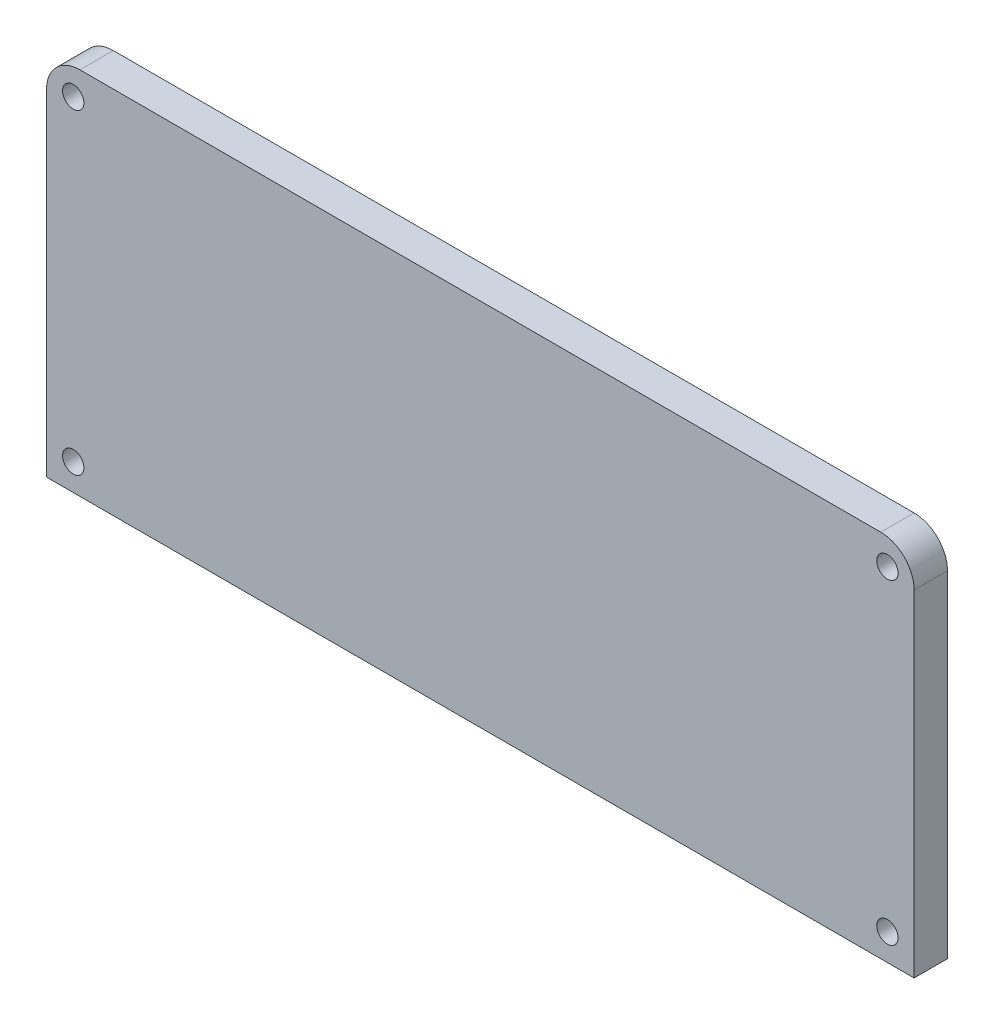
ISO-10303-21;
HEADER;
FILE_DESCRIPTION(('STEP AP214'),'2;1');
FILE_NAME('part.step','',(''),(''),'','','');
FILE_SCHEMA(('AUTOMOTIVE_DESIGN { 1 0 10303 214 1 1 1 1 }'));
ENDSEC;
DATA;
#1=APPLICATION_CONTEXT('core data for automotive mechanical design processes');
#2=APPLICATION_PROTOCOL_DEFINITION('international standard','automotive_design',2000,#1);
#3=PRODUCT_CONTEXT('',#1,'mechanical');
#4=PRODUCT('Part','Part','',(#3));
#5=PRODUCT_RELATED_PRODUCT_CATEGORY('part','',(#4));
#6=PRODUCT_DEFINITION_FORMATION('','',#4);
#7=PRODUCT_DEFINITION_CONTEXT('part definition',#1,'design');
#8=PRODUCT_DEFINITION('design','',#6,#7);
#9=PRODUCT_DEFINITION_SHAPE('','',#8);
#10=(LENGTH_UNIT() NAMED_UNIT(*) SI_UNIT(.MILLI.,.METRE.));
#11=(NAMED_UNIT(*) PLANE_ANGLE_UNIT() SI_UNIT($,.RADIAN.));
#12=(NAMED_UNIT(*) SI_UNIT($,.STERADIAN.) SOLID_ANGLE_UNIT());
#13=UNCERTAINTY_MEASURE_WITH_UNIT(LENGTH_MEASURE(1.E-05),#10,'distance_accuracy_value','');
#14=(GEOMETRIC_REPRESENTATION_CONTEXT(3) GLOBAL_UNCERTAINTY_ASSIGNED_CONTEXT((#13)) GLOBAL_UNIT_ASSIGNED_CONTEXT((#10,
#11,#12)) REPRESENTATION_CONTEXT('',''));
#15=CARTESIAN_POINT('',(0.,0.,0.));
#16=DIRECTION('',(0.,0.,1.));
#17=DIRECTION('',(1.,0.,0.));
#18=AXIS2_PLACEMENT_3D('',#15,#16,#17);
#19=CARTESIAN_POINT('',(5.,50.3553390593273,-125.));
#20=DIRECTION('',(0.,0.,-1.));
#21=DIRECTION('',(-1.,0.,0.));
#22=AXIS2_PLACEMENT_3D('',#19,#20,#21);
#23=PLANE('',#22);
#24=CARTESIAN_POINT('',(126.,51.3553390593273,-125.));
#25=DIRECTION('',(0.,0.,-1.));
#26=DIRECTION('',(-1.,0.,0.));
#27=AXIS2_PLACEMENT_3D('',#24,#25,#26);
#28=CIRCLE('',#27,3.14999999999999);
#29=CARTESIAN_POINT('',(122.85,51.3553390593273,-125.));
#30=VERTEX_POINT('',#29);
#31=EDGE_CURVE('E237',#30,#30,#28,.T.);
#32=ORIENTED_EDGE('',*,*,#31,.F.);
#33=EDGE_LOOP('',(#32));
#34=FACE_BOUND('',#33,.T.);
#35=CARTESIAN_POINT('',(126.,4.,-125.));
#36=DIRECTION('',(0.,0.,-1.));
#37=DIRECTION('',(-1.,0.,0.));
#38=AXIS2_PLACEMENT_3D('',#35,#36,#37);
#39=CIRCLE('',#38,3.14999999999999);
#40=CARTESIAN_POINT('',(122.85,4.,-125.));
#41=VERTEX_POINT('',#40);
#42=EDGE_CURVE('E157',#41,#41,#39,.T.);
#43=ORIENTED_EDGE('',*,*,#42,.F.);
#44=EDGE_LOOP('',(#43));
#45=FACE_BOUND('',#44,.T.);
#46=CARTESIAN_POINT('',(4.,51.3553390593273,-125.));
#47=DIRECTION('',(0.,0.,-1.));
#48=DIRECTION('',(-1.,0.,0.));
#49=AXIS2_PLACEMENT_3D('',#46,#47,#48);
#50=CIRCLE('',#49,3.15);
#51=CARTESIAN_POINT('',(0.85,51.3553390593273,-125.));
#52=VERTEX_POINT('',#51);
#53=EDGE_CURVE('E150',#52,#52,#50,.T.);
#54=ORIENTED_EDGE('',*,*,#53,.F.);
#55=EDGE_LOOP('',(#54));
#56=FACE_BOUND('',#55,.T.);
#57=CARTESIAN_POINT('',(4.,4.,-125.));
#58=DIRECTION('',(0.,0.,-1.));
#59=DIRECTION('',(-1.,0.,0.));
#60=AXIS2_PLACEMENT_3D('',#57,#58,#59);
#61=CIRCLE('',#60,3.15);
#62=CARTESIAN_POINT('',(0.850000000000004,4.,-125.));
#63=VERTEX_POINT('',#62);
#64=EDGE_CURVE('E146',#63,#63,#61,.T.);
#65=ORIENTED_EDGE('',*,*,#64,.F.);
#66=EDGE_LOOP('',(#65));
#67=FACE_BOUND('',#66,.T.);
#68=DIRECTION('',(-1.,0.,0.));
#69=VECTOR('',#68,1.);
#70=CARTESIAN_POINT('',(130.,0.,-125.));
#71=LINE('',#70,#69);
#72=CARTESIAN_POINT('',(130.,0.,-125.));
#73=VERTEX_POINT('',#72);
#74=CARTESIAN_POINT('',(0.,0.,-125.));
#75=VERTEX_POINT('',#74);
#76=EDGE_CURVE('E135',#73,#75,#71,.T.);
#77=ORIENTED_EDGE('',*,*,#76,.T.);
#78=DIRECTION('',(0.,1.,0.));
#79=VECTOR('',#78,1.);
#80=CARTESIAN_POINT('',(0.,0.,-125.));
#81=LINE('',#80,#79);
#82=CARTESIAN_POINT('',(0.,50.3553390593273,-125.));
#83=VERTEX_POINT('',#82);
#84=EDGE_CURVE('E94',#75,#83,#81,.T.);
#85=ORIENTED_EDGE('',*,*,#84,.T.);
#86=CARTESIAN_POINT('',(5.,50.3553390593273,-125.));
#87=DIRECTION('',(0.,0.,-1.));
#88=DIRECTION('',(-1.,0.,0.));
#89=AXIS2_PLACEMENT_3D('',#86,#87,#88);
#90=CIRCLE('',#89,5.);
#91=CARTESIAN_POINT('',(5.,55.3553390593273,-125.));
#92=VERTEX_POINT('',#91);
#93=EDGE_CURVE('E106',#83,#92,#90,.T.);
#94=ORIENTED_EDGE('',*,*,#93,.T.);
#95=DIRECTION('',(1.,0.,0.));
#96=VECTOR('',#95,1.);
#97=CARTESIAN_POINT('',(5.,55.3553390593273,-125.));
#98=LINE('',#97,#96);
#99=CARTESIAN_POINT('',(125.,55.3553390593273,-125.));
#100=VERTEX_POINT('',#99);
#101=EDGE_CURVE('E101',#92,#100,#98,.T.);
#102=ORIENTED_EDGE('',*,*,#101,.T.);
#103=CARTESIAN_POINT('',(125.,50.3553390593273,-125.));
#104=DIRECTION('',(0.,0.,-1.));
#105=DIRECTION('',(-1.,0.,0.));
#106=AXIS2_PLACEMENT_3D('',#103,#104,#105);
#107=CIRCLE('',#106,5.);
#108=CARTESIAN_POINT('',(130.,50.3553390593273,-125.));
#109=VERTEX_POINT('',#108);
#110=EDGE_CURVE('E104',#100,#109,#107,.T.);
#111=ORIENTED_EDGE('',*,*,#110,.T.);
#112=DIRECTION('',(0.,-1.,0.));
#113=VECTOR('',#112,1.);
#114=CARTESIAN_POINT('',(130.,50.3553390593273,-125.));
#115=LINE('',#114,#113);
#116=EDGE_CURVE('E57',#109,#73,#115,.T.);
#117=ORIENTED_EDGE('',*,*,#116,.T.);
#118=EDGE_LOOP('',(#77,#85,#94,#102,#111,#117));
#119=FACE_BOUND('',#118,.T.);
#120=ADVANCED_FACE('F38',(#34,#45,#56,#67,#119),#23,.T.);
#121=CARTESIAN_POINT('',(5.,50.3553390593273,-120.));
#122=DIRECTION('',(0.,0.,-1.));
#123=DIRECTION('',(-1.,0.,0.));
#124=AXIS2_PLACEMENT_3D('',#121,#122,#123);
#125=PLANE('',#124);
#126=CARTESIAN_POINT('',(126.,51.3553390593273,-120.));
#127=DIRECTION('',(0.,0.,-1.));
#128=DIRECTION('',(-1.,0.,0.));
#129=AXIS2_PLACEMENT_3D('',#126,#127,#128);
#130=CIRCLE('',#129,1.59999999999999);
#131=CARTESIAN_POINT('',(124.4,51.3553390593273,-120.));
#132=VERTEX_POINT('',#131);
#133=EDGE_CURVE('E42',#132,#132,#130,.T.);
#134=ORIENTED_EDGE('',*,*,#133,.T.);
#135=EDGE_LOOP('',(#134));
#136=FACE_BOUND('',#135,.T.);
#137=CARTESIAN_POINT('',(126.,4.,-120.));
#138=DIRECTION('',(0.,0.,-1.));
#139=DIRECTION('',(-1.,0.,0.));
#140=AXIS2_PLACEMENT_3D('',#137,#138,#139);
#141=CIRCLE('',#140,1.59999999999999);
#142=CARTESIAN_POINT('',(124.4,4.,-120.));
#143=VERTEX_POINT('',#142);
#144=EDGE_CURVE('E148',#143,#143,#141,.T.);
#145=ORIENTED_EDGE('',*,*,#144,.T.);
#146=EDGE_LOOP('',(#145));
#147=FACE_BOUND('',#146,.T.);
#148=CARTESIAN_POINT('',(4.,51.3553390593273,-120.));
#149=DIRECTION('',(0.,0.,-1.));
#150=DIRECTION('',(-1.,0.,0.));
#151=AXIS2_PLACEMENT_3D('',#148,#149,#150);
#152=CIRCLE('',#151,1.59999999999999);
#153=CARTESIAN_POINT('',(2.40000000000001,51.3553390593273,-120.));
#154=VERTEX_POINT('',#153);
#155=EDGE_CURVE('E144',#154,#154,#152,.T.);
#156=ORIENTED_EDGE('',*,*,#155,.T.);
#157=EDGE_LOOP('',(#156));
#158=FACE_BOUND('',#157,.T.);
#159=CARTESIAN_POINT('',(4.,4.,-120.));
#160=DIRECTION('',(0.,0.,-1.));
#161=DIRECTION('',(-1.,0.,0.));
#162=AXIS2_PLACEMENT_3D('',#159,#160,#161);
#163=CIRCLE('',#162,1.59999999999999);
#164=CARTESIAN_POINT('',(2.40000000000002,4.,-120.));
#165=VERTEX_POINT('',#164);
#166=EDGE_CURVE('E128',#165,#165,#163,.T.);
#167=ORIENTED_EDGE('',*,*,#166,.T.);
#168=EDGE_LOOP('',(#167));
#169=FACE_BOUND('',#168,.T.);
#170=DIRECTION('',(-1.,0.,0.));
#171=VECTOR('',#170,1.);
#172=CARTESIAN_POINT('',(130.,0.,-120.));
#173=LINE('',#172,#171);
#174=CARTESIAN_POINT('',(130.,0.,-120.));
#175=VERTEX_POINT('',#174);
#176=CARTESIAN_POINT('',(0.,0.,-120.));
#177=VERTEX_POINT('',#176);
#178=EDGE_CURVE('E124',#175,#177,#173,.T.);
#179=ORIENTED_EDGE('',*,*,#178,.F.);
#180=DIRECTION('',(0.,-1.,0.));
#181=VECTOR('',#180,1.);
#182=CARTESIAN_POINT('',(130.,50.3553390593273,-120.));
#183=LINE('',#182,#181);
#184=CARTESIAN_POINT('',(130.,50.3553390593273,-120.));
#185=VERTEX_POINT('',#184);
#186=EDGE_CURVE('E86',#185,#175,#183,.T.);
#187=ORIENTED_EDGE('',*,*,#186,.F.);
#188=CARTESIAN_POINT('',(125.,50.3553390593273,-120.));
#189=DIRECTION('',(0.,0.,-1.));
#190=DIRECTION('',(-1.,0.,0.));
#191=AXIS2_PLACEMENT_3D('',#188,#189,#190);
#192=CIRCLE('',#191,5.);
#193=CARTESIAN_POINT('',(125.,55.3553390593273,-120.));
#194=VERTEX_POINT('',#193);
#195=EDGE_CURVE('E80',#194,#185,#192,.T.);
#196=ORIENTED_EDGE('',*,*,#195,.F.);
#197=DIRECTION('',(1.,0.,0.));
#198=VECTOR('',#197,1.);
#199=CARTESIAN_POINT('',(5.,55.3553390593273,-120.));
#200=LINE('',#199,#198);
#201=CARTESIAN_POINT('',(5.,55.3553390593273,-120.));
#202=VERTEX_POINT('',#201);
#203=EDGE_CURVE('E114',#202,#194,#200,.T.);
#204=ORIENTED_EDGE('',*,*,#203,.F.);
#205=CARTESIAN_POINT('',(5.,50.3553390593273,-120.));
#206=DIRECTION('',(0.,0.,-1.));
#207=DIRECTION('',(-1.,0.,0.));
#208=AXIS2_PLACEMENT_3D('',#205,#206,#207);
#209=CIRCLE('',#208,5.);
#210=CARTESIAN_POINT('',(0.,50.3553390593273,-120.));
#211=VERTEX_POINT('',#210);
#212=EDGE_CURVE('E130',#211,#202,#209,.T.);
#213=ORIENTED_EDGE('',*,*,#212,.F.);
#214=DIRECTION('',(0.,1.,0.));
#215=VECTOR('',#214,1.);
#216=CARTESIAN_POINT('',(0.,0.,-120.));
#217=LINE('',#216,#215);
#218=EDGE_CURVE('E127',#177,#211,#217,.T.);
#219=ORIENTED_EDGE('',*,*,#218,.F.);
#220=EDGE_LOOP('',(#179,#187,#196,#204,#213,#219));
#221=FACE_BOUND('',#220,.T.);
#222=ADVANCED_FACE('F180',(#136,#147,#158,#169,#221),#125,.F.);
#223=CARTESIAN_POINT('',(130.,0.,-125.));
#224=DIRECTION('',(0.,1.,0.));
#225=DIRECTION('',(0.,0.,1.));
#226=AXIS2_PLACEMENT_3D('',#223,#224,#225);
#227=PLANE('',#226);
#228=ORIENTED_EDGE('',*,*,#178,.T.);
#229=DIRECTION('',(0.,0.,1.));
#230=VECTOR('',#229,1.);
#231=CARTESIAN_POINT('',(0.,0.,-125.));
#232=LINE('',#231,#230);
#233=EDGE_CURVE('E11',#75,#177,#232,.T.);
#234=ORIENTED_EDGE('',*,*,#233,.F.);
#235=ORIENTED_EDGE('',*,*,#76,.F.);
#236=DIRECTION('',(0.,0.,1.));
#237=VECTOR('',#236,1.);
#238=CARTESIAN_POINT('',(130.,0.,-125.));
#239=LINE('',#238,#237);
#240=EDGE_CURVE('E120',#73,#175,#239,.T.);
#241=ORIENTED_EDGE('',*,*,#240,.T.);
#242=EDGE_LOOP('',(#228,#234,#235,#241));
#243=FACE_BOUND('',#242,.T.);
#244=ADVANCED_FACE('F40',(#243),#227,.F.);
#245=CARTESIAN_POINT('',(0.,0.,-125.));
#246=DIRECTION('',(1.,0.,0.));
#247=DIRECTION('',(0.,0.,-1.));
#248=AXIS2_PLACEMENT_3D('',#245,#246,#247);
#249=PLANE('',#248);
#250=ORIENTED_EDGE('',*,*,#218,.T.);
#251=DIRECTION('',(0.,0.,1.));
#252=VECTOR('',#251,1.);
#253=CARTESIAN_POINT('',(0.,50.3553390593273,-125.));
#254=LINE('',#253,#252);
#255=EDGE_CURVE('E48',#83,#211,#254,.T.);
#256=ORIENTED_EDGE('',*,*,#255,.F.);
#257=ORIENTED_EDGE('',*,*,#84,.F.);
#258=ORIENTED_EDGE('',*,*,#233,.T.);
#259=EDGE_LOOP('',(#250,#256,#257,#258));
#260=FACE_BOUND('',#259,.T.);
#261=ADVANCED_FACE('F174',(#260),#249,.F.);
#262=CARTESIAN_POINT('',(5.,50.3553390593273,-125.));
#263=DIRECTION('',(0.,0.,1.));
#264=DIRECTION('',(1.,0.,0.));
#265=AXIS2_PLACEMENT_3D('',#262,#263,#264);
#266=CYLINDRICAL_SURFACE('',#265,5.);
#267=ORIENTED_EDGE('',*,*,#212,.T.);
#268=DIRECTION('',(0.,0.,1.));
#269=VECTOR('',#268,1.);
#270=CARTESIAN_POINT('',(5.,55.3553390593273,-125.));
#271=LINE('',#270,#269);
#272=EDGE_CURVE('E115',#92,#202,#271,.T.);
#273=ORIENTED_EDGE('',*,*,#272,.F.);
#274=ORIENTED_EDGE('',*,*,#93,.F.);
#275=ORIENTED_EDGE('',*,*,#255,.T.);
#276=EDGE_LOOP('',(#267,#273,#274,#275));
#277=FACE_BOUND('',#276,.T.);
#278=ADVANCED_FACE('F177',(#277),#266,.T.);
#279=CARTESIAN_POINT('',(5.,55.3553390593273,-125.));
#280=DIRECTION('',(0.,-1.,0.));
#281=DIRECTION('',(0.,0.,-1.));
#282=AXIS2_PLACEMENT_3D('',#279,#280,#281);
#283=PLANE('',#282);
#284=ORIENTED_EDGE('',*,*,#203,.T.);
#285=DIRECTION('',(0.,0.,1.));
#286=VECTOR('',#285,1.);
#287=CARTESIAN_POINT('',(125.,55.3553390593273,-125.));
#288=LINE('',#287,#286);
#289=EDGE_CURVE('E111',#100,#194,#288,.T.);
#290=ORIENTED_EDGE('',*,*,#289,.F.);
#291=ORIENTED_EDGE('',*,*,#101,.F.);
#292=ORIENTED_EDGE('',*,*,#272,.T.);
#293=EDGE_LOOP('',(#284,#290,#291,#292));
#294=FACE_BOUND('',#293,.T.);
#295=ADVANCED_FACE('F112',(#294),#283,.F.);
#296=CARTESIAN_POINT('',(125.,50.3553390593273,-125.));
#297=DIRECTION('',(0.,0.,1.));
#298=DIRECTION('',(1.,0.,0.));
#299=AXIS2_PLACEMENT_3D('',#296,#297,#298);
#300=CYLINDRICAL_SURFACE('',#299,5.);
#301=ORIENTED_EDGE('',*,*,#195,.T.);
#302=DIRECTION('',(0.,0.,1.));
#303=VECTOR('',#302,1.);
#304=CARTESIAN_POINT('',(130.,50.3553390593273,-125.));
#305=LINE('',#304,#303);
#306=EDGE_CURVE('E116',#109,#185,#305,.T.);
#307=ORIENTED_EDGE('',*,*,#306,.F.);
#308=ORIENTED_EDGE('',*,*,#110,.F.);
#309=ORIENTED_EDGE('',*,*,#289,.T.);
#310=EDGE_LOOP('',(#301,#307,#308,#309));
#311=FACE_BOUND('',#310,.T.);
#312=ADVANCED_FACE('F118',(#311),#300,.T.);
#313=CARTESIAN_POINT('',(130.,50.3553390593273,-125.));
#314=DIRECTION('',(-1.,0.,0.));
#315=DIRECTION('',(0.,0.,1.));
#316=AXIS2_PLACEMENT_3D('',#313,#314,#315);
#317=PLANE('',#316);
#318=ORIENTED_EDGE('',*,*,#186,.T.);
#319=ORIENTED_EDGE('',*,*,#240,.F.);
#320=ORIENTED_EDGE('',*,*,#116,.F.);
#321=ORIENTED_EDGE('',*,*,#306,.T.);
#322=EDGE_LOOP('',(#318,#319,#320,#321));
#323=FACE_BOUND('',#322,.T.);
#324=ADVANCED_FACE('F182',(#323),#317,.F.);
#325=CARTESIAN_POINT('',(4.,4.,-125.));
#326=DIRECTION('',(0.,0.,-1.));
#327=DIRECTION('',(-1.,0.,0.));
#328=AXIS2_PLACEMENT_3D('',#325,#326,#327);
#329=CYLINDRICAL_SURFACE('',#328,1.59999999999999);
#330=CARTESIAN_POINT('',(4.,4.,-123.45));
#331=DIRECTION('',(0.,0.,-1.));
#332=DIRECTION('',(-1.,0.,0.));
#333=AXIS2_PLACEMENT_3D('',#330,#331,#332);
#334=CIRCLE('',#333,1.59999999999999);
#335=CARTESIAN_POINT('',(2.40000000000002,4.,-123.45));
#336=VERTEX_POINT('',#335);
#337=EDGE_CURVE('E143',#336,#336,#334,.T.);
#338=ORIENTED_EDGE('',*,*,#337,.T.);
#339=EDGE_LOOP('',(#338));
#340=FACE_BOUND('',#339,.T.);
#341=ORIENTED_EDGE('',*,*,#166,.F.);
#342=EDGE_LOOP('',(#341));
#343=FACE_BOUND('',#342,.T.);
#344=ADVANCED_FACE('F184',(#340,#343),#329,.F.);
#345=CARTESIAN_POINT('',(4.,4.,-125.));
#346=DIRECTION('',(0.,0.,-1.));
#347=DIRECTION('',(-1.,0.,0.));
#348=AXIS2_PLACEMENT_3D('',#345,#346,#347);
#349=CONICAL_SURFACE('',#348,3.15,0.785398163397453);
#350=ORIENTED_EDGE('',*,*,#337,.F.);
#351=EDGE_LOOP('',(#350));
#352=FACE_BOUND('',#351,.T.);
#353=ORIENTED_EDGE('',*,*,#64,.T.);
#354=EDGE_LOOP('',(#353));
#355=FACE_BOUND('',#354,.T.);
#356=ADVANCED_FACE('F190',(#352,#355),#349,.F.);
#357=CARTESIAN_POINT('',(4.,51.3553390593273,-125.));
#358=DIRECTION('',(0.,0.,-1.));
#359=DIRECTION('',(-1.,0.,0.));
#360=AXIS2_PLACEMENT_3D('',#357,#358,#359);
#361=CYLINDRICAL_SURFACE('',#360,1.59999999999999);
#362=CARTESIAN_POINT('',(4.,51.3553390593273,-123.45));
#363=DIRECTION('',(0.,0.,-1.));
#364=DIRECTION('',(-1.,0.,0.));
#365=AXIS2_PLACEMENT_3D('',#362,#363,#364);
#366=CIRCLE('',#365,1.59999999999999);
#367=CARTESIAN_POINT('',(2.40000000000001,51.3553390593273,-123.45));
#368=VERTEX_POINT('',#367);
#369=EDGE_CURVE('E147',#368,#368,#366,.T.);
#370=ORIENTED_EDGE('',*,*,#369,.T.);
#371=EDGE_LOOP('',(#370));
#372=FACE_BOUND('',#371,.T.);
#373=ORIENTED_EDGE('',*,*,#155,.F.);
#374=EDGE_LOOP('',(#373));
#375=FACE_BOUND('',#374,.T.);
#376=ADVANCED_FACE('F207',(#372,#375),#361,.F.);
#377=CARTESIAN_POINT('',(4.,51.3553390593273,-125.));
#378=DIRECTION('',(0.,0.,-1.));
#379=DIRECTION('',(-1.,0.,0.));
#380=AXIS2_PLACEMENT_3D('',#377,#378,#379);
#381=CONICAL_SURFACE('',#380,3.15,0.785398163397453);
#382=ORIENTED_EDGE('',*,*,#369,.F.);
#383=EDGE_LOOP('',(#382));
#384=FACE_BOUND('',#383,.T.);
#385=ORIENTED_EDGE('',*,*,#53,.T.);
#386=EDGE_LOOP('',(#385));
#387=FACE_BOUND('',#386,.T.);
#388=ADVANCED_FACE('F211',(#384,#387),#381,.F.);
#389=CARTESIAN_POINT('',(126.,4.,-125.));
#390=DIRECTION('',(0.,0.,-1.));
#391=DIRECTION('',(-1.,0.,0.));
#392=AXIS2_PLACEMENT_3D('',#389,#390,#391);
#393=CYLINDRICAL_SURFACE('',#392,1.59999999999999);
#394=CARTESIAN_POINT('',(126.,4.,-123.45));
#395=DIRECTION('',(0.,0.,-1.));
#396=DIRECTION('',(-1.,0.,0.));
#397=AXIS2_PLACEMENT_3D('',#394,#395,#396);
#398=CIRCLE('',#397,1.59999999999999);
#399=CARTESIAN_POINT('',(124.4,4.,-123.45));
#400=VERTEX_POINT('',#399);
#401=EDGE_CURVE('E151',#400,#400,#398,.T.);
#402=ORIENTED_EDGE('',*,*,#401,.T.);
#403=EDGE_LOOP('',(#402));
#404=FACE_BOUND('',#403,.T.);
#405=ORIENTED_EDGE('',*,*,#144,.F.);
#406=EDGE_LOOP('',(#405));
#407=FACE_BOUND('',#406,.T.);
#408=ADVANCED_FACE('F215',(#404,#407),#393,.F.);
#409=CARTESIAN_POINT('',(126.,4.,-125.));
#410=DIRECTION('',(0.,0.,-1.));
#411=DIRECTION('',(-1.,0.,0.));
#412=AXIS2_PLACEMENT_3D('',#409,#410,#411);
#413=CONICAL_SURFACE('',#412,3.14999999999999,0.785398163397448);
#414=ORIENTED_EDGE('',*,*,#401,.F.);
#415=EDGE_LOOP('',(#414));
#416=FACE_BOUND('',#415,.T.);
#417=ORIENTED_EDGE('',*,*,#42,.T.);
#418=EDGE_LOOP('',(#417));
#419=FACE_BOUND('',#418,.T.);
#420=ADVANCED_FACE('F219',(#416,#419),#413,.F.);
#421=CARTESIAN_POINT('',(126.,51.3553390593273,-125.));
#422=DIRECTION('',(0.,0.,-1.));
#423=DIRECTION('',(-1.,0.,0.));
#424=AXIS2_PLACEMENT_3D('',#421,#422,#423);
#425=CYLINDRICAL_SURFACE('',#424,1.59999999999999);
#426=CARTESIAN_POINT('',(126.,51.3553390593273,-123.45));
#427=DIRECTION('',(0.,0.,-1.));
#428=DIRECTION('',(-1.,0.,0.));
#429=AXIS2_PLACEMENT_3D('',#426,#427,#428);
#430=CIRCLE('',#429,1.59999999999999);
#431=CARTESIAN_POINT('',(124.4,51.3553390593273,-123.45));
#432=VERTEX_POINT('',#431);
#433=EDGE_CURVE('E235',#432,#432,#430,.T.);
#434=ORIENTED_EDGE('',*,*,#433,.T.);
#435=EDGE_LOOP('',(#434));
#436=FACE_BOUND('',#435,.T.);
#437=ORIENTED_EDGE('',*,*,#133,.F.);
#438=EDGE_LOOP('',(#437));
#439=FACE_BOUND('',#438,.T.);
#440=ADVANCED_FACE('F222',(#436,#439),#425,.F.);
#441=CARTESIAN_POINT('',(126.,51.3553390593273,-125.));
#442=DIRECTION('',(0.,0.,-1.));
#443=DIRECTION('',(-1.,0.,0.));
#444=AXIS2_PLACEMENT_3D('',#441,#442,#443);
#445=CONICAL_SURFACE('',#444,3.14999999999999,0.785398163397448);
#446=ORIENTED_EDGE('',*,*,#433,.F.);
#447=EDGE_LOOP('',(#446));
#448=FACE_BOUND('',#447,.T.);
#449=ORIENTED_EDGE('',*,*,#31,.T.);
#450=EDGE_LOOP('',(#449));
#451=FACE_BOUND('',#450,.T.);
#452=ADVANCED_FACE('F226',(#448,#451),#445,.F.);
#453=CLOSED_SHELL('',(#120,#222,#244,#261,#278,#295,#312,#324,#344,#356,#376,#388,#408,#420,
#440,#452));
#454=MANIFOLD_SOLID_BREP('B2',#453);
#455=ADVANCED_BREP_SHAPE_REPRESENTATION('',(#18,#454),#14);
#456=SHAPE_DEFINITION_REPRESENTATION(#9,#455);
ENDSEC;
END-ISO-10303-21;
